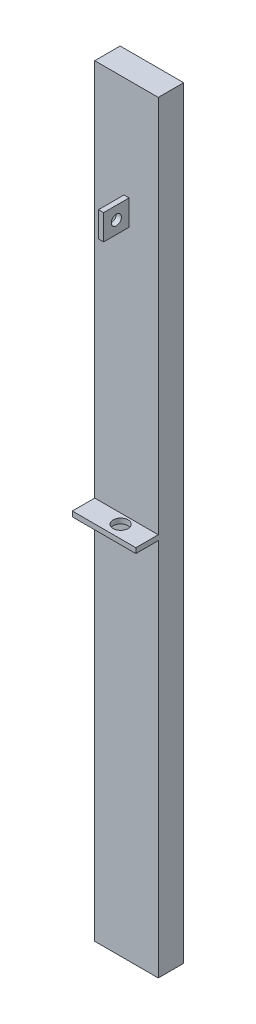
ISO-10303-21;
HEADER;
FILE_DESCRIPTION(('STEP AP214'),'2;1');
FILE_NAME('part.step','',(''),(''),'','','');
FILE_SCHEMA(('AUTOMOTIVE_DESIGN { 1 0 10303 214 1 1 1 1 }'));
ENDSEC;
DATA;
#1=APPLICATION_CONTEXT('core data for automotive mechanical design processes');
#2=APPLICATION_PROTOCOL_DEFINITION('international standard','automotive_design',2000,#1);
#3=PRODUCT_CONTEXT('',#1,'mechanical');
#4=PRODUCT('Part','Part','',(#3));
#5=PRODUCT_RELATED_PRODUCT_CATEGORY('part','',(#4));
#6=PRODUCT_DEFINITION_FORMATION('','',#4);
#7=PRODUCT_DEFINITION_CONTEXT('part definition',#1,'design');
#8=PRODUCT_DEFINITION('design','',#6,#7);
#9=PRODUCT_DEFINITION_SHAPE('','',#8);
#10=(LENGTH_UNIT() NAMED_UNIT(*) SI_UNIT(.MILLI.,.METRE.));
#11=(NAMED_UNIT(*) PLANE_ANGLE_UNIT() SI_UNIT($,.RADIAN.));
#12=(NAMED_UNIT(*) SI_UNIT($,.STERADIAN.) SOLID_ANGLE_UNIT());
#13=UNCERTAINTY_MEASURE_WITH_UNIT(LENGTH_MEASURE(1.E-05),#10,'distance_accuracy_value','');
#14=(GEOMETRIC_REPRESENTATION_CONTEXT(3) GLOBAL_UNCERTAINTY_ASSIGNED_CONTEXT((#13)) GLOBAL_UNIT_ASSIGNED_CONTEXT((#10,
#11,#12)) REPRESENTATION_CONTEXT('',''));
#15=CARTESIAN_POINT('',(0.,0.,0.));
#16=DIRECTION('',(0.,0.,1.));
#17=DIRECTION('',(1.,0.,0.));
#18=AXIS2_PLACEMENT_3D('',#15,#16,#17);
#19=CARTESIAN_POINT('',(-9.41176470588237,-121.5,10.));
#20=DIRECTION('',(0.,1.,0.));
#21=DIRECTION('',(0.,0.,1.));
#22=AXIS2_PLACEMENT_3D('',#19,#20,#21);
#23=PLANE('',#22);
#24=CARTESIAN_POINT('',(-20.4117647058824,-121.5,13.8205771129421));
#25=DIRECTION('',(0.,-1.,0.));
#26=DIRECTION('',(0.,0.,-1.));
#27=AXIS2_PLACEMENT_3D('',#24,#25,#26);
#28=CIRCLE('',#27,2.9593130763986);
#29=CARTESIAN_POINT('',(-20.4117647058824,-121.5,10.8612640365435));
#30=VERTEX_POINT('',#29);
#31=EDGE_CURVE('E224',#30,#30,#28,.T.);
#32=ORIENTED_EDGE('',*,*,#31,.T.);
#33=EDGE_LOOP('',(#32));
#34=FACE_BOUND('',#33,.T.);
#35=DIRECTION('',(0.,0.,-1.));
#36=VECTOR('',#35,1.);
#37=CARTESIAN_POINT('',(-34.4117647058824,-121.5,10.));
#38=LINE('',#37,#36);
#39=CARTESIAN_POINT('',(-34.4117647058824,-121.5,18.8205771129422));
#40=VERTEX_POINT('',#39);
#41=CARTESIAN_POINT('',(-34.4117647058824,-121.5,10.));
#42=VERTEX_POINT('',#41);
#43=EDGE_CURVE('E234',#40,#42,#38,.T.);
#44=ORIENTED_EDGE('',*,*,#43,.F.);
#45=DIRECTION('',(-1.,0.,0.));
#46=VECTOR('',#45,1.);
#47=CARTESIAN_POINT('',(-9.41176470588237,-121.5,18.8205771129422));
#48=LINE('',#47,#46);
#49=CARTESIAN_POINT('',(-9.41176470588237,-121.5,18.8205771129422));
#50=VERTEX_POINT('',#49);
#51=EDGE_CURVE('E252',#50,#40,#48,.T.);
#52=ORIENTED_EDGE('',*,*,#51,.F.);
#53=DIRECTION('',(0.,0.,-1.));
#54=VECTOR('',#53,1.);
#55=CARTESIAN_POINT('',(-9.41176470588237,-121.5,10.));
#56=LINE('',#55,#54);
#57=CARTESIAN_POINT('',(-9.41176470588235,-121.5,10.));
#58=VERTEX_POINT('',#57);
#59=EDGE_CURVE('E237',#50,#58,#56,.T.);
#60=ORIENTED_EDGE('',*,*,#59,.T.);
#61=DIRECTION('',(-1.,0.,0.));
#62=VECTOR('',#61,1.);
#63=CARTESIAN_POINT('',(-9.41176470588237,-121.5,10.));
#64=LINE('',#63,#62);
#65=EDGE_CURVE('E248',#58,#42,#64,.T.);
#66=ORIENTED_EDGE('',*,*,#65,.T.);
#67=EDGE_LOOP('',(#44,#52,#60,#66));
#68=FACE_BOUND('',#67,.T.);
#69=ADVANCED_FACE('F38',(#34,#68),#23,.T.);
#70=CARTESIAN_POINT('',(-9.41176470588237,-121.5,18.8205771129422));
#71=DIRECTION('',(0.,0.,1.));
#72=DIRECTION('',(0.,-1.,0.));
#73=AXIS2_PLACEMENT_3D('',#70,#71,#72);
#74=PLANE('',#73);
#75=DIRECTION('',(0.,1.,0.));
#76=VECTOR('',#75,1.);
#77=CARTESIAN_POINT('',(-34.4117647058824,-121.5,18.8205771129422));
#78=LINE('',#77,#76);
#79=CARTESIAN_POINT('',(-34.4117647058824,-123.5,18.8205771129421));
#80=VERTEX_POINT('',#79);
#81=EDGE_CURVE('E243',#80,#40,#78,.T.);
#82=ORIENTED_EDGE('',*,*,#81,.F.);
#83=DIRECTION('',(-1.,0.,0.));
#84=VECTOR('',#83,1.);
#85=CARTESIAN_POINT('',(-9.41176470588237,-123.5,18.8205771129421));
#86=LINE('',#85,#84);
#87=CARTESIAN_POINT('',(-9.41176470588237,-123.5,18.8205771129421));
#88=VERTEX_POINT('',#87);
#89=EDGE_CURVE('E254',#88,#80,#86,.T.);
#90=ORIENTED_EDGE('',*,*,#89,.F.);
#91=DIRECTION('',(0.,1.,0.));
#92=VECTOR('',#91,1.);
#93=CARTESIAN_POINT('',(-9.41176470588237,-121.5,18.8205771129422));
#94=LINE('',#93,#92);
#95=EDGE_CURVE('E233',#88,#50,#94,.T.);
#96=ORIENTED_EDGE('',*,*,#95,.T.);
#97=ORIENTED_EDGE('',*,*,#51,.T.);
#98=EDGE_LOOP('',(#82,#90,#96,#97));
#99=FACE_BOUND('',#98,.T.);
#100=ADVANCED_FACE('F319',(#99),#74,.T.);
#101=CARTESIAN_POINT('',(-9.41176470588237,-123.5,18.8205771129421));
#102=DIRECTION('',(0.,-1.,0.));
#103=DIRECTION('',(0.,0.,-1.));
#104=AXIS2_PLACEMENT_3D('',#101,#102,#103);
#105=PLANE('',#104);
#106=CARTESIAN_POINT('',(-20.4117647058824,-123.5,13.8205771129421));
#107=DIRECTION('',(0.,-1.,0.));
#108=DIRECTION('',(0.,0.,-1.));
#109=AXIS2_PLACEMENT_3D('',#106,#107,#108);
#110=CIRCLE('',#109,2.9593130763986);
#111=CARTESIAN_POINT('',(-20.4117647058824,-123.5,10.8612640365435));
#112=VERTEX_POINT('',#111);
#113=EDGE_CURVE('E223',#112,#112,#110,.T.);
#114=ORIENTED_EDGE('',*,*,#113,.F.);
#115=EDGE_LOOP('',(#114));
#116=FACE_BOUND('',#115,.T.);
#117=DIRECTION('',(0.,0.,1.));
#118=VECTOR('',#117,1.);
#119=CARTESIAN_POINT('',(-34.4117647058824,-123.5,18.8205771129421));
#120=LINE('',#119,#118);
#121=CARTESIAN_POINT('',(-34.4117647058824,-123.5,10.));
#122=VERTEX_POINT('',#121);
#123=EDGE_CURVE('E227',#122,#80,#120,.T.);
#124=ORIENTED_EDGE('',*,*,#123,.F.);
#125=DIRECTION('',(-1.,0.,0.));
#126=VECTOR('',#125,1.);
#127=CARTESIAN_POINT('',(-9.41176470588237,-123.5,10.));
#128=LINE('',#127,#126);
#129=CARTESIAN_POINT('',(-9.41176470588235,-123.5,10.));
#130=VERTEX_POINT('',#129);
#131=EDGE_CURVE('E240',#130,#122,#128,.T.);
#132=ORIENTED_EDGE('',*,*,#131,.F.);
#133=DIRECTION('',(0.,0.,1.));
#134=VECTOR('',#133,1.);
#135=CARTESIAN_POINT('',(-9.41176470588237,-123.5,18.8205771129421));
#136=LINE('',#135,#134);
#137=EDGE_CURVE('E230',#130,#88,#136,.T.);
#138=ORIENTED_EDGE('',*,*,#137,.T.);
#139=ORIENTED_EDGE('',*,*,#89,.T.);
#140=EDGE_LOOP('',(#124,#132,#138,#139));
#141=FACE_BOUND('',#140,.T.);
#142=ADVANCED_FACE('F314',(#116,#141),#105,.T.);
#143=CARTESIAN_POINT('',(0.,0.,10.));
#144=DIRECTION('',(0.,0.,-1.));
#145=DIRECTION('',(-1.,0.,0.));
#146=AXIS2_PLACEMENT_3D('',#143,#144,#145);
#147=PLANE('',#146);
#148=DIRECTION('',(1.,0.,0.));
#149=VECTOR('',#148,1.);
#150=CARTESIAN_POINT('',(0.,-12.5,10.));
#151=LINE('',#150,#149);
#152=CARTESIAN_POINT('',(-22.9117647058824,-12.5,10.));
#153=VERTEX_POINT('',#152);
#154=CARTESIAN_POINT('',(-20.9117647058824,-12.5,10.));
#155=VERTEX_POINT('',#154);
#156=EDGE_CURVE('E210',#153,#155,#151,.T.);
#157=ORIENTED_EDGE('',*,*,#156,.T.);
#158=DIRECTION('',(0.,-1.,0.));
#159=VECTOR('',#158,1.);
#160=CARTESIAN_POINT('',(-20.9117647058824,0.,10.));
#161=LINE('',#160,#159);
#162=CARTESIAN_POINT('',(-20.9117647058824,-22.5,10.));
#163=VERTEX_POINT('',#162);
#164=EDGE_CURVE('E193',#155,#163,#161,.T.);
#165=ORIENTED_EDGE('',*,*,#164,.T.);
#166=DIRECTION('',(-1.,0.,0.));
#167=VECTOR('',#166,1.);
#168=CARTESIAN_POINT('',(0.,-22.5,10.));
#169=LINE('',#168,#167);
#170=CARTESIAN_POINT('',(-22.9117647058824,-22.5,10.));
#171=VERTEX_POINT('',#170);
#172=EDGE_CURVE('E198',#163,#171,#169,.T.);
#173=ORIENTED_EDGE('',*,*,#172,.T.);
#174=DIRECTION('',(0.,1.,0.));
#175=VECTOR('',#174,1.);
#176=CARTESIAN_POINT('',(-22.9117647058824,0.,10.));
#177=LINE('',#176,#175);
#178=EDGE_CURVE('E62',#171,#153,#177,.T.);
#179=ORIENTED_EDGE('',*,*,#178,.T.);
#180=EDGE_LOOP('',(#157,#165,#173,#179));
#181=FACE_BOUND('',#180,.T.);
#182=DIRECTION('',(0.,-1.,0.));
#183=VECTOR('',#182,1.);
#184=CARTESIAN_POINT('',(-34.4117647058824,-272.5,10.));
#185=LINE('',#184,#183);
#186=CARTESIAN_POINT('',(-34.4117647058824,27.5,10.));
#187=VERTEX_POINT('',#186);
#188=EDGE_CURVE('E258',#187,#42,#185,.T.);
#189=ORIENTED_EDGE('',*,*,#188,.T.);
#190=ORIENTED_EDGE('',*,*,#65,.F.);
#191=DIRECTION('',(0.,1.,0.));
#192=VECTOR('',#191,1.);
#193=CARTESIAN_POINT('',(-9.41176470588237,27.5,10.));
#194=LINE('',#193,#192);
#195=CARTESIAN_POINT('',(-9.41176470588237,27.5,10.));
#196=VERTEX_POINT('',#195);
#197=EDGE_CURVE('E263',#58,#196,#194,.T.);
#198=ORIENTED_EDGE('',*,*,#197,.T.);
#199=DIRECTION('',(-1.,0.,0.));
#200=VECTOR('',#199,1.);
#201=CARTESIAN_POINT('',(-34.4117647058824,27.5,10.));
#202=LINE('',#201,#200);
#203=EDGE_CURVE('E266',#196,#187,#202,.T.);
#204=ORIENTED_EDGE('',*,*,#203,.T.);
#205=EDGE_LOOP('',(#189,#190,#198,#204));
#206=FACE_BOUND('',#205,.T.);
#207=ADVANCED_FACE('F305',(#181,#206),#147,.F.);
#208=CARTESIAN_POINT('',(-9.41176470588233,-272.5,10.));
#209=VERTEX_POINT('',#208);
#210=EDGE_CURVE('E264',#209,#130,#194,.T.);
#211=ORIENTED_EDGE('',*,*,#210,.T.);
#212=ORIENTED_EDGE('',*,*,#131,.T.);
#213=CARTESIAN_POINT('',(-34.4117647058824,-272.5,10.));
#214=VERTEX_POINT('',#213);
#215=EDGE_CURVE('E261',#122,#214,#185,.T.);
#216=ORIENTED_EDGE('',*,*,#215,.T.);
#217=DIRECTION('',(1.,0.,0.));
#218=VECTOR('',#217,1.);
#219=CARTESIAN_POINT('',(-9.41176470588233,-272.5,10.));
#220=LINE('',#219,#218);
#221=EDGE_CURVE('E260',#214,#209,#220,.T.);
#222=ORIENTED_EDGE('',*,*,#221,.T.);
#223=EDGE_LOOP('',(#211,#212,#216,#222));
#224=FACE_BOUND('',#223,.T.);
#225=ADVANCED_FACE('F317',(#224),#147,.F.);
#226=CARTESIAN_POINT('',(0.,0.,0.));
#227=DIRECTION('',(0.,0.,-1.));
#228=DIRECTION('',(-1.,0.,0.));
#229=AXIS2_PLACEMENT_3D('',#226,#227,#228);
#230=PLANE('',#229);
#231=DIRECTION('',(1.,0.,0.));
#232=VECTOR('',#231,1.);
#233=CARTESIAN_POINT('',(-32.9117647058824,26.,0.));
#234=LINE('',#233,#232);
#235=CARTESIAN_POINT('',(-32.9117647058824,26.,0.));
#236=VERTEX_POINT('',#235);
#237=CARTESIAN_POINT('',(-10.9117647058823,26.,0.));
#238=VERTEX_POINT('',#237);
#239=EDGE_CURVE('E54',#236,#238,#234,.T.);
#240=ORIENTED_EDGE('',*,*,#239,.F.);
#241=DIRECTION('',(0.,1.,0.));
#242=VECTOR('',#241,1.);
#243=CARTESIAN_POINT('',(-32.9117647058824,-271.,0.));
#244=LINE('',#243,#242);
#245=CARTESIAN_POINT('',(-32.9117647058824,-271.,0.));
#246=VERTEX_POINT('',#245);
#247=EDGE_CURVE('E172',#246,#236,#244,.T.);
#248=ORIENTED_EDGE('',*,*,#247,.F.);
#249=DIRECTION('',(-1.,0.,0.));
#250=VECTOR('',#249,1.);
#251=CARTESIAN_POINT('',(-10.9117647058823,-271.,0.));
#252=LINE('',#251,#250);
#253=CARTESIAN_POINT('',(-10.9117647058823,-271.,0.));
#254=VERTEX_POINT('',#253);
#255=EDGE_CURVE('E175',#254,#246,#252,.T.);
#256=ORIENTED_EDGE('',*,*,#255,.F.);
#257=DIRECTION('',(0.,-1.,0.));
#258=VECTOR('',#257,1.);
#259=CARTESIAN_POINT('',(-10.9117647058823,26.,0.));
#260=LINE('',#259,#258);
#261=EDGE_CURVE('E181',#238,#254,#260,.T.);
#262=ORIENTED_EDGE('',*,*,#261,.F.);
#263=EDGE_LOOP('',(#240,#248,#256,#262));
#264=FACE_BOUND('',#263,.T.);
#265=DIRECTION('',(0.,-1.,0.));
#266=VECTOR('',#265,1.);
#267=CARTESIAN_POINT('',(-34.4117647058824,-272.5,0.));
#268=LINE('',#267,#266);
#269=CARTESIAN_POINT('',(-34.4117647058824,27.5,0.));
#270=VERTEX_POINT('',#269);
#271=CARTESIAN_POINT('',(-34.4117647058824,-272.5,0.));
#272=VERTEX_POINT('',#271);
#273=EDGE_CURVE('E251',#270,#272,#268,.T.);
#274=ORIENTED_EDGE('',*,*,#273,.F.);
#275=DIRECTION('',(-1.,0.,0.));
#276=VECTOR('',#275,1.);
#277=CARTESIAN_POINT('',(-34.4117647058824,27.5,0.));
#278=LINE('',#277,#276);
#279=CARTESIAN_POINT('',(-9.41176470588237,27.5,0.));
#280=VERTEX_POINT('',#279);
#281=EDGE_CURVE('E275',#280,#270,#278,.T.);
#282=ORIENTED_EDGE('',*,*,#281,.F.);
#283=DIRECTION('',(0.,1.,0.));
#284=VECTOR('',#283,1.);
#285=CARTESIAN_POINT('',(-9.41176470588237,27.5,0.));
#286=LINE('',#285,#284);
#287=CARTESIAN_POINT('',(-9.41176470588233,-272.5,0.));
#288=VERTEX_POINT('',#287);
#289=EDGE_CURVE('E273',#288,#280,#286,.T.);
#290=ORIENTED_EDGE('',*,*,#289,.F.);
#291=DIRECTION('',(1.,0.,0.));
#292=VECTOR('',#291,1.);
#293=CARTESIAN_POINT('',(-9.41176470588233,-272.5,0.));
#294=LINE('',#293,#292);
#295=EDGE_CURVE('E271',#272,#288,#294,.T.);
#296=ORIENTED_EDGE('',*,*,#295,.F.);
#297=EDGE_LOOP('',(#274,#282,#290,#296));
#298=FACE_BOUND('',#297,.T.);
#299=ADVANCED_FACE('F295',(#264,#298),#230,.T.);
#300=CARTESIAN_POINT('',(-34.4117647058824,-272.5,10.));
#301=DIRECTION('',(1.,0.,0.));
#302=DIRECTION('',(0.,0.,-1.));
#303=AXIS2_PLACEMENT_3D('',#300,#301,#302);
#304=PLANE('',#303);
#305=ORIENTED_EDGE('',*,*,#273,.T.);
#306=DIRECTION('',(0.,0.,-1.));
#307=VECTOR('',#306,1.);
#308=CARTESIAN_POINT('',(-34.4117647058824,-272.5,10.));
#309=LINE('',#308,#307);
#310=EDGE_CURVE('E11',#214,#272,#309,.T.);
#311=ORIENTED_EDGE('',*,*,#310,.F.);
#312=ORIENTED_EDGE('',*,*,#215,.F.);
#313=ORIENTED_EDGE('',*,*,#123,.T.);
#314=ORIENTED_EDGE('',*,*,#81,.T.);
#315=ORIENTED_EDGE('',*,*,#43,.T.);
#316=ORIENTED_EDGE('',*,*,#188,.F.);
#317=DIRECTION('',(0.,0.,-1.));
#318=VECTOR('',#317,1.);
#319=CARTESIAN_POINT('',(-34.4117647058824,27.5,10.));
#320=LINE('',#319,#318);
#321=EDGE_CURVE('E268',#187,#270,#320,.T.);
#322=ORIENTED_EDGE('',*,*,#321,.T.);
#323=EDGE_LOOP('',(#305,#311,#312,#313,#314,#315,#316,#322));
#324=FACE_BOUND('',#323,.T.);
#325=ADVANCED_FACE('F40',(#324),#304,.F.);
#326=CARTESIAN_POINT('',(-9.41176470588233,-272.5,10.));
#327=DIRECTION('',(0.,1.,0.));
#328=DIRECTION('',(0.,0.,1.));
#329=AXIS2_PLACEMENT_3D('',#326,#327,#328);
#330=PLANE('',#329);
#331=ORIENTED_EDGE('',*,*,#295,.T.);
#332=DIRECTION('',(0.,0.,-1.));
#333=VECTOR('',#332,1.);
#334=CARTESIAN_POINT('',(-9.41176470588233,-272.5,10.));
#335=LINE('',#334,#333);
#336=EDGE_CURVE('E47',#209,#288,#335,.T.);
#337=ORIENTED_EDGE('',*,*,#336,.F.);
#338=ORIENTED_EDGE('',*,*,#221,.F.);
#339=ORIENTED_EDGE('',*,*,#310,.T.);
#340=EDGE_LOOP('',(#331,#337,#338,#339));
#341=FACE_BOUND('',#340,.T.);
#342=ADVANCED_FACE('F318',(#341),#330,.F.);
#343=CARTESIAN_POINT('',(-9.41176470588237,27.5,10.));
#344=DIRECTION('',(-1.,0.,0.));
#345=DIRECTION('',(0.,-1.,0.));
#346=AXIS2_PLACEMENT_3D('',#343,#344,#345);
#347=PLANE('',#346);
#348=ORIENTED_EDGE('',*,*,#289,.T.);
#349=DIRECTION('',(0.,0.,-1.));
#350=VECTOR('',#349,1.);
#351=CARTESIAN_POINT('',(-9.41176470588237,27.5,10.));
#352=LINE('',#351,#350);
#353=EDGE_CURVE('E279',#196,#280,#352,.T.);
#354=ORIENTED_EDGE('',*,*,#353,.F.);
#355=ORIENTED_EDGE('',*,*,#197,.F.);
#356=ORIENTED_EDGE('',*,*,#59,.F.);
#357=ORIENTED_EDGE('',*,*,#95,.F.);
#358=ORIENTED_EDGE('',*,*,#137,.F.);
#359=ORIENTED_EDGE('',*,*,#210,.F.);
#360=ORIENTED_EDGE('',*,*,#336,.T.);
#361=EDGE_LOOP('',(#348,#354,#355,#356,#357,#358,#359,#360));
#362=FACE_BOUND('',#361,.T.);
#363=ADVANCED_FACE('F287',(#362),#347,.F.);
#364=CARTESIAN_POINT('',(-34.4117647058824,27.5,10.));
#365=DIRECTION('',(0.,-1.,0.));
#366=DIRECTION('',(0.,0.,-1.));
#367=AXIS2_PLACEMENT_3D('',#364,#365,#366);
#368=PLANE('',#367);
#369=ORIENTED_EDGE('',*,*,#281,.T.);
#370=ORIENTED_EDGE('',*,*,#321,.F.);
#371=ORIENTED_EDGE('',*,*,#203,.F.);
#372=ORIENTED_EDGE('',*,*,#353,.T.);
#373=EDGE_LOOP('',(#369,#370,#371,#372));
#374=FACE_BOUND('',#373,.T.);
#375=ADVANCED_FACE('F298',(#374),#368,.F.);
#376=CARTESIAN_POINT('',(-20.4117647058824,-121.5,13.8205771129421));
#377=DIRECTION('',(0.,-1.,0.));
#378=DIRECTION('',(0.,0.,-1.));
#379=AXIS2_PLACEMENT_3D('',#376,#377,#378);
#380=CYLINDRICAL_SURFACE('',#379,2.9593130763986);
#381=ORIENTED_EDGE('',*,*,#31,.F.);
#382=EDGE_LOOP('',(#381));
#383=FACE_BOUND('',#382,.T.);
#384=ORIENTED_EDGE('',*,*,#113,.T.);
#385=EDGE_LOOP('',(#384));
#386=FACE_BOUND('',#385,.T.);
#387=ADVANCED_FACE('F339',(#383,#386),#380,.F.);
#388=CARTESIAN_POINT('',(-20.9117647058824,0.,20.));
#389=DIRECTION('',(1.,0.,0.));
#390=DIRECTION('',(0.,0.,-1.));
#391=AXIS2_PLACEMENT_3D('',#388,#389,#390);
#392=PLANE('',#391);
#393=CARTESIAN_POINT('',(-20.9117647058824,-17.5,15.));
#394=DIRECTION('',(1.,0.,0.));
#395=DIRECTION('',(0.,0.,-1.));
#396=AXIS2_PLACEMENT_3D('',#393,#394,#395);
#397=CIRCLE('',#396,2.);
#398=CARTESIAN_POINT('',(-20.9117647058824,-17.5,13.));
#399=VERTEX_POINT('',#398);
#400=EDGE_CURVE('E190',#399,#399,#397,.T.);
#401=ORIENTED_EDGE('',*,*,#400,.F.);
#402=EDGE_LOOP('',(#401));
#403=FACE_BOUND('',#402,.T.);
#404=ORIENTED_EDGE('',*,*,#164,.F.);
#405=DIRECTION('',(0.,0.,-1.));
#406=VECTOR('',#405,1.);
#407=CARTESIAN_POINT('',(-20.9117647058824,-12.5,20.));
#408=LINE('',#407,#406);
#409=CARTESIAN_POINT('',(-20.9117647058824,-12.5,20.));
#410=VERTEX_POINT('',#409);
#411=EDGE_CURVE('E221',#410,#155,#408,.T.);
#412=ORIENTED_EDGE('',*,*,#411,.F.);
#413=DIRECTION('',(0.,-1.,0.));
#414=VECTOR('',#413,1.);
#415=CARTESIAN_POINT('',(-20.9117647058824,0.,20.));
#416=LINE('',#415,#414);
#417=CARTESIAN_POINT('',(-20.9117647058824,-22.5,20.));
#418=VERTEX_POINT('',#417);
#419=EDGE_CURVE('E194',#410,#418,#416,.T.);
#420=ORIENTED_EDGE('',*,*,#419,.T.);
#421=DIRECTION('',(0.,0.,-1.));
#422=VECTOR('',#421,1.);
#423=CARTESIAN_POINT('',(-20.9117647058824,-22.5,20.));
#424=LINE('',#423,#422);
#425=EDGE_CURVE('E207',#418,#163,#424,.T.);
#426=ORIENTED_EDGE('',*,*,#425,.T.);
#427=EDGE_LOOP('',(#404,#412,#420,#426));
#428=FACE_BOUND('',#427,.T.);
#429=ADVANCED_FACE('F381',(#403,#428),#392,.T.);
#430=CARTESIAN_POINT('',(0.,-12.5,20.));
#431=DIRECTION('',(0.,1.,0.));
#432=DIRECTION('',(-1.,0.,0.));
#433=AXIS2_PLACEMENT_3D('',#430,#431,#432);
#434=PLANE('',#433);
#435=ORIENTED_EDGE('',*,*,#156,.F.);
#436=DIRECTION('',(0.,0.,-1.));
#437=VECTOR('',#436,1.);
#438=CARTESIAN_POINT('',(-22.9117647058824,-12.5,20.));
#439=LINE('',#438,#437);
#440=CARTESIAN_POINT('',(-22.9117647058824,-12.5,20.));
#441=VERTEX_POINT('',#440);
#442=EDGE_CURVE('E219',#441,#153,#439,.T.);
#443=ORIENTED_EDGE('',*,*,#442,.F.);
#444=DIRECTION('',(1.,0.,0.));
#445=VECTOR('',#444,1.);
#446=CARTESIAN_POINT('',(0.,-12.5,20.));
#447=LINE('',#446,#445);
#448=EDGE_CURVE('E197',#441,#410,#447,.T.);
#449=ORIENTED_EDGE('',*,*,#448,.T.);
#450=ORIENTED_EDGE('',*,*,#411,.T.);
#451=EDGE_LOOP('',(#435,#443,#449,#450));
#452=FACE_BOUND('',#451,.T.);
#453=ADVANCED_FACE('F394',(#452),#434,.T.);
#454=CARTESIAN_POINT('',(-22.9117647058824,0.,20.));
#455=DIRECTION('',(-1.,0.,0.));
#456=DIRECTION('',(0.,0.,1.));
#457=AXIS2_PLACEMENT_3D('',#454,#455,#456);
#458=PLANE('',#457);
#459=CARTESIAN_POINT('',(-22.9117647058824,-17.5,15.));
#460=DIRECTION('',(-1.,0.,0.));
#461=DIRECTION('',(0.,0.,1.));
#462=AXIS2_PLACEMENT_3D('',#459,#460,#461);
#463=CIRCLE('',#462,2.);
#464=CARTESIAN_POINT('',(-22.9117647058824,-17.5,17.));
#465=VERTEX_POINT('',#464);
#466=EDGE_CURVE('E42',#465,#465,#463,.T.);
#467=ORIENTED_EDGE('',*,*,#466,.F.);
#468=EDGE_LOOP('',(#467));
#469=FACE_BOUND('',#468,.T.);
#470=ORIENTED_EDGE('',*,*,#178,.F.);
#471=DIRECTION('',(0.,0.,-1.));
#472=VECTOR('',#471,1.);
#473=CARTESIAN_POINT('',(-22.9117647058824,-22.5,20.));
#474=LINE('',#473,#472);
#475=CARTESIAN_POINT('',(-22.9117647058824,-22.5,20.));
#476=VERTEX_POINT('',#475);
#477=EDGE_CURVE('E217',#476,#171,#474,.T.);
#478=ORIENTED_EDGE('',*,*,#477,.F.);
#479=DIRECTION('',(0.,1.,0.));
#480=VECTOR('',#479,1.);
#481=CARTESIAN_POINT('',(-22.9117647058824,0.,20.));
#482=LINE('',#481,#480);
#483=EDGE_CURVE('E201',#476,#441,#482,.T.);
#484=ORIENTED_EDGE('',*,*,#483,.T.);
#485=ORIENTED_EDGE('',*,*,#442,.T.);
#486=EDGE_LOOP('',(#470,#478,#484,#485));
#487=FACE_BOUND('',#486,.T.);
#488=ADVANCED_FACE('F402',(#469,#487),#458,.T.);
#489=CARTESIAN_POINT('',(0.,-22.5,20.));
#490=DIRECTION('',(0.,-1.,0.));
#491=DIRECTION('',(0.,0.,-1.));
#492=AXIS2_PLACEMENT_3D('',#489,#490,#491);
#493=PLANE('',#492);
#494=ORIENTED_EDGE('',*,*,#172,.F.);
#495=ORIENTED_EDGE('',*,*,#425,.F.);
#496=DIRECTION('',(-1.,0.,0.));
#497=VECTOR('',#496,1.);
#498=CARTESIAN_POINT('',(0.,-22.5,20.));
#499=LINE('',#498,#497);
#500=EDGE_CURVE('E204',#418,#476,#499,.T.);
#501=ORIENTED_EDGE('',*,*,#500,.T.);
#502=ORIENTED_EDGE('',*,*,#477,.T.);
#503=EDGE_LOOP('',(#494,#495,#501,#502));
#504=FACE_BOUND('',#503,.T.);
#505=ADVANCED_FACE('F410',(#504),#493,.T.);
#506=CARTESIAN_POINT('',(0.,0.,20.));
#507=DIRECTION('',(0.,0.,1.));
#508=DIRECTION('',(1.,0.,0.));
#509=AXIS2_PLACEMENT_3D('',#506,#507,#508);
#510=PLANE('',#509);
#511=ORIENTED_EDGE('',*,*,#419,.F.);
#512=ORIENTED_EDGE('',*,*,#448,.F.);
#513=ORIENTED_EDGE('',*,*,#483,.F.);
#514=ORIENTED_EDGE('',*,*,#500,.F.);
#515=EDGE_LOOP('',(#511,#512,#513,#514));
#516=FACE_BOUND('',#515,.T.);
#517=ADVANCED_FACE('F417',(#516),#510,.T.);
#518=CARTESIAN_POINT('',(-19.4117647058824,-17.5,15.));
#519=DIRECTION('',(-1.,0.,0.));
#520=DIRECTION('',(0.,0.,1.));
#521=AXIS2_PLACEMENT_3D('',#518,#519,#520);
#522=CYLINDRICAL_SURFACE('',#521,2.);
#523=ORIENTED_EDGE('',*,*,#400,.T.);
#524=EDGE_LOOP('',(#523));
#525=FACE_BOUND('',#524,.T.);
#526=ORIENTED_EDGE('',*,*,#466,.T.);
#527=EDGE_LOOP('',(#526));
#528=FACE_BOUND('',#527,.T.);
#529=ADVANCED_FACE('F424',(#525,#528),#522,.F.);
#530=CARTESIAN_POINT('',(-32.9117647058824,26.,8.));
#531=DIRECTION('',(0.,1.,0.));
#532=DIRECTION('',(-1.,0.,0.));
#533=AXIS2_PLACEMENT_3D('',#530,#531,#532);
#534=PLANE('',#533);
#535=ORIENTED_EDGE('',*,*,#239,.T.);
#536=DIRECTION('',(0.,0.,-1.));
#537=VECTOR('',#536,1.);
#538=CARTESIAN_POINT('',(-10.9117647058823,26.,8.));
#539=LINE('',#538,#537);
#540=CARTESIAN_POINT('',(-10.9117647058823,26.,8.));
#541=VERTEX_POINT('',#540);
#542=EDGE_CURVE('E150',#541,#238,#539,.T.);
#543=ORIENTED_EDGE('',*,*,#542,.F.);
#544=DIRECTION('',(1.,0.,0.));
#545=VECTOR('',#544,1.);
#546=CARTESIAN_POINT('',(-32.9117647058824,26.,8.));
#547=LINE('',#546,#545);
#548=CARTESIAN_POINT('',(-32.9117647058824,26.,8.));
#549=VERTEX_POINT('',#548);
#550=EDGE_CURVE('E154',#549,#541,#547,.T.);
#551=ORIENTED_EDGE('',*,*,#550,.F.);
#552=DIRECTION('',(0.,0.,-1.));
#553=VECTOR('',#552,1.);
#554=CARTESIAN_POINT('',(-32.9117647058824,26.,8.));
#555=LINE('',#554,#553);
#556=EDGE_CURVE('E185',#549,#236,#555,.T.);
#557=ORIENTED_EDGE('',*,*,#556,.T.);
#558=EDGE_LOOP('',(#535,#543,#551,#557));
#559=FACE_BOUND('',#558,.T.);
#560=ADVANCED_FACE('F152',(#559),#534,.F.);
#561=CARTESIAN_POINT('',(-32.9117647058824,-271.,8.));
#562=DIRECTION('',(-1.,0.,0.));
#563=DIRECTION('',(0.,0.,1.));
#564=AXIS2_PLACEMENT_3D('',#561,#562,#563);
#565=PLANE('',#564);
#566=ORIENTED_EDGE('',*,*,#247,.T.);
#567=ORIENTED_EDGE('',*,*,#556,.F.);
#568=DIRECTION('',(0.,1.,0.));
#569=VECTOR('',#568,1.);
#570=CARTESIAN_POINT('',(-32.9117647058824,-271.,8.));
#571=LINE('',#570,#569);
#572=CARTESIAN_POINT('',(-32.9117647058824,-271.,8.));
#573=VERTEX_POINT('',#572);
#574=EDGE_CURVE('E160',#573,#549,#571,.T.);
#575=ORIENTED_EDGE('',*,*,#574,.F.);
#576=DIRECTION('',(0.,0.,-1.));
#577=VECTOR('',#576,1.);
#578=CARTESIAN_POINT('',(-32.9117647058824,-271.,8.));
#579=LINE('',#578,#577);
#580=EDGE_CURVE('E187',#573,#246,#579,.T.);
#581=ORIENTED_EDGE('',*,*,#580,.T.);
#582=EDGE_LOOP('',(#566,#567,#575,#581));
#583=FACE_BOUND('',#582,.T.);
#584=ADVANCED_FACE('F437',(#583),#565,.F.);
#585=CARTESIAN_POINT('',(-10.9117647058823,-271.,8.));
#586=DIRECTION('',(0.,-1.,0.));
#587=DIRECTION('',(0.,0.,-1.));
#588=AXIS2_PLACEMENT_3D('',#585,#586,#587);
#589=PLANE('',#588);
#590=ORIENTED_EDGE('',*,*,#255,.T.);
#591=ORIENTED_EDGE('',*,*,#580,.F.);
#592=DIRECTION('',(-1.,0.,0.));
#593=VECTOR('',#592,1.);
#594=CARTESIAN_POINT('',(-10.9117647058823,-271.,8.));
#595=LINE('',#594,#593);
#596=CARTESIAN_POINT('',(-10.9117647058823,-271.,8.));
#597=VERTEX_POINT('',#596);
#598=EDGE_CURVE('E168',#597,#573,#595,.T.);
#599=ORIENTED_EDGE('',*,*,#598,.F.);
#600=DIRECTION('',(0.,0.,-1.));
#601=VECTOR('',#600,1.);
#602=CARTESIAN_POINT('',(-10.9117647058823,-271.,8.));
#603=LINE('',#602,#601);
#604=EDGE_CURVE('E159',#597,#254,#603,.T.);
#605=ORIENTED_EDGE('',*,*,#604,.T.);
#606=EDGE_LOOP('',(#590,#591,#599,#605));
#607=FACE_BOUND('',#606,.T.);
#608=ADVANCED_FACE('F444',(#607),#589,.F.);
#609=CARTESIAN_POINT('',(-10.9117647058823,26.,8.));
#610=DIRECTION('',(1.,0.,0.));
#611=DIRECTION('',(0.,1.,0.));
#612=AXIS2_PLACEMENT_3D('',#609,#610,#611);
#613=PLANE('',#612);
#614=ORIENTED_EDGE('',*,*,#261,.T.);
#615=ORIENTED_EDGE('',*,*,#604,.F.);
#616=DIRECTION('',(0.,-1.,0.));
#617=VECTOR('',#616,1.);
#618=CARTESIAN_POINT('',(-10.9117647058823,26.,8.));
#619=LINE('',#618,#617);
#620=EDGE_CURVE('E163',#541,#597,#619,.T.);
#621=ORIENTED_EDGE('',*,*,#620,.F.);
#622=ORIENTED_EDGE('',*,*,#542,.T.);
#623=EDGE_LOOP('',(#614,#615,#621,#622));
#624=FACE_BOUND('',#623,.T.);
#625=ADVANCED_FACE('F164',(#624),#613,.F.);
#626=CARTESIAN_POINT('',(0.,0.,8.));
#627=DIRECTION('',(0.,0.,-1.));
#628=DIRECTION('',(-1.,0.,0.));
#629=AXIS2_PLACEMENT_3D('',#626,#627,#628);
#630=PLANE('',#629);
#631=ORIENTED_EDGE('',*,*,#550,.T.);
#632=ORIENTED_EDGE('',*,*,#620,.T.);
#633=ORIENTED_EDGE('',*,*,#598,.T.);
#634=ORIENTED_EDGE('',*,*,#574,.T.);
#635=EDGE_LOOP('',(#631,#632,#633,#634));
#636=FACE_BOUND('',#635,.T.);
#637=ADVANCED_FACE('F170',(#636),#630,.T.);
#638=CLOSED_SHELL('',(#69,#100,#142,#207,#225,#299,#325,#342,#363,#375,#387,#429,#453,#488,#505,
#517,#529,#560,#584,#608,#625,#637));
#639=MANIFOLD_SOLID_BREP('B2',#638);
#640=ADVANCED_BREP_SHAPE_REPRESENTATION('',(#18,#639),#14);
#641=SHAPE_DEFINITION_REPRESENTATION(#9,#640);
ENDSEC;
END-ISO-10303-21;
